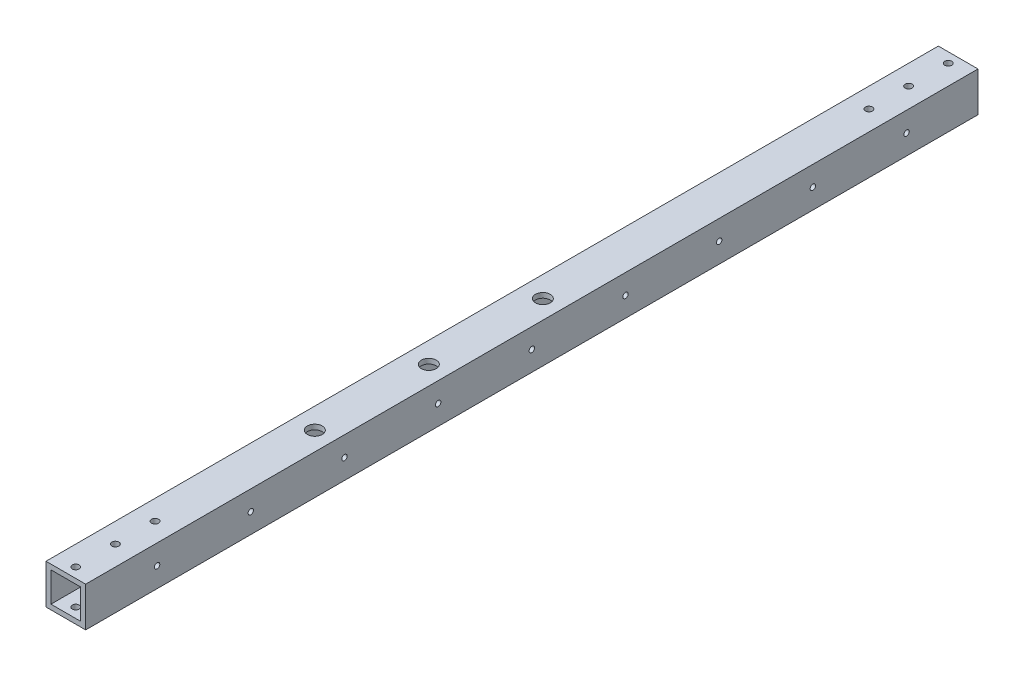
ISO-10303-21;
HEADER;
FILE_DESCRIPTION(('STEP AP214'),'2;1');
FILE_NAME('part.step','',(''),(''),'','','');
FILE_SCHEMA(('AUTOMOTIVE_DESIGN { 1 0 10303 214 1 1 1 1 }'));
ENDSEC;
DATA;
#1=APPLICATION_CONTEXT('core data for automotive mechanical design processes');
#2=APPLICATION_PROTOCOL_DEFINITION('international standard','automotive_design',2000,#1);
#3=PRODUCT_CONTEXT('',#1,'mechanical');
#4=PRODUCT('Part','Part','',(#3));
#5=PRODUCT_RELATED_PRODUCT_CATEGORY('part','',(#4));
#6=PRODUCT_DEFINITION_FORMATION('','',#4);
#7=PRODUCT_DEFINITION_CONTEXT('part definition',#1,'design');
#8=PRODUCT_DEFINITION('design','',#6,#7);
#9=PRODUCT_DEFINITION_SHAPE('','',#8);
#10=(LENGTH_UNIT() NAMED_UNIT(*) SI_UNIT(.MILLI.,.METRE.));
#11=(NAMED_UNIT(*) PLANE_ANGLE_UNIT() SI_UNIT($,.RADIAN.));
#12=(NAMED_UNIT(*) SI_UNIT($,.STERADIAN.) SOLID_ANGLE_UNIT());
#13=UNCERTAINTY_MEASURE_WITH_UNIT(LENGTH_MEASURE(1.E-05),#10,'distance_accuracy_value','');
#14=(GEOMETRIC_REPRESENTATION_CONTEXT(3) GLOBAL_UNCERTAINTY_ASSIGNED_CONTEXT((#13)) GLOBAL_UNIT_ASSIGNED_CONTEXT((#10,
#11,#12)) REPRESENTATION_CONTEXT('',''));
#15=CARTESIAN_POINT('',(0.,0.,0.));
#16=DIRECTION('',(0.,0.,1.));
#17=DIRECTION('',(1.,0.,0.));
#18=AXIS2_PLACEMENT_3D('',#15,#16,#17);
#19=CARTESIAN_POINT('',(-12.7,-12.7,571.5));
#20=DIRECTION('',(0.,1.,0.));
#21=DIRECTION('',(0.,0.,1.));
#22=AXIS2_PLACEMENT_3D('',#19,#20,#21);
#23=PLANE('',#22);
#24=CARTESIAN_POINT('',(0.700000000011636,-12.6999999999999,339.725));
#25=DIRECTION('',(0.,-1.,0.));
#26=DIRECTION('',(0.,0.,-1.));
#27=AXIS2_PLACEMENT_3D('',#24,#25,#26);
#28=CIRCLE('',#27,4.76249999999999);
#29=CARTESIAN_POINT('',(0.700000000011636,-12.6999999999999,334.9625));
#30=VERTEX_POINT('',#29);
#31=EDGE_CURVE('E420',#30,#30,#28,.T.);
#32=ORIENTED_EDGE('',*,*,#31,.F.);
#33=EDGE_LOOP('',(#32));
#34=FACE_BOUND('',#33,.T.);
#35=CARTESIAN_POINT('',(0.700000000011636,-12.6999999999999,412.75));
#36=DIRECTION('',(0.,-1.,0.));
#37=DIRECTION('',(0.,0.,-1.));
#38=AXIS2_PLACEMENT_3D('',#35,#36,#37);
#39=CIRCLE('',#38,4.76249999999999);
#40=CARTESIAN_POINT('',(0.700000000011636,-12.6999999999999,407.9875));
#41=VERTEX_POINT('',#40);
#42=EDGE_CURVE('E241',#41,#41,#39,.T.);
#43=ORIENTED_EDGE('',*,*,#42,.F.);
#44=EDGE_LOOP('',(#43));
#45=FACE_BOUND('',#44,.T.);
#46=CARTESIAN_POINT('',(0.,-12.7,6.35));
#47=DIRECTION('',(0.,1.,0.));
#48=DIRECTION('',(0.,0.,1.));
#49=AXIS2_PLACEMENT_3D('',#46,#47,#48);
#50=CIRCLE('',#49,2.24789999999999);
#51=CARTESIAN_POINT('',(0.,-12.7,8.59789999999999));
#52=VERTEX_POINT('',#51);
#53=EDGE_CURVE('E210',#52,#52,#50,.T.);
#54=ORIENTED_EDGE('',*,*,#53,.T.);
#55=EDGE_LOOP('',(#54));
#56=FACE_BOUND('',#55,.T.);
#57=CARTESIAN_POINT('',(0.,-12.7,31.75));
#58=DIRECTION('',(0.,1.,0.));
#59=DIRECTION('',(0.,0.,1.));
#60=AXIS2_PLACEMENT_3D('',#57,#58,#59);
#61=CIRCLE('',#60,2.24789999999999);
#62=CARTESIAN_POINT('',(0.,-12.7,33.9979));
#63=VERTEX_POINT('',#62);
#64=EDGE_CURVE('E205',#63,#63,#61,.T.);
#65=ORIENTED_EDGE('',*,*,#64,.T.);
#66=EDGE_LOOP('',(#65));
#67=FACE_BOUND('',#66,.T.);
#68=CARTESIAN_POINT('',(0.,-12.7,57.1499999999999));
#69=DIRECTION('',(0.,1.,0.));
#70=DIRECTION('',(0.,0.,1.));
#71=AXIS2_PLACEMENT_3D('',#68,#69,#70);
#72=CIRCLE('',#71,2.24789999999999);
#73=CARTESIAN_POINT('',(0.,-12.7,59.3978999999999));
#74=VERTEX_POINT('',#73);
#75=EDGE_CURVE('E299',#74,#74,#72,.T.);
#76=ORIENTED_EDGE('',*,*,#75,.T.);
#77=EDGE_LOOP('',(#76));
#78=FACE_BOUND('',#77,.T.);
#79=CARTESIAN_POINT('',(0.,-12.7,539.75));
#80=DIRECTION('',(0.,1.,0.));
#81=DIRECTION('',(0.,0.,1.));
#82=AXIS2_PLACEMENT_3D('',#79,#80,#81);
#83=CIRCLE('',#82,2.24789999999999);
#84=CARTESIAN_POINT('',(0.,-12.7,541.9979));
#85=VERTEX_POINT('',#84);
#86=EDGE_CURVE('E200',#85,#85,#83,.T.);
#87=ORIENTED_EDGE('',*,*,#86,.T.);
#88=EDGE_LOOP('',(#87));
#89=FACE_BOUND('',#88,.T.);
#90=CARTESIAN_POINT('',(0.,-12.7,514.35));
#91=DIRECTION('',(0.,1.,0.));
#92=DIRECTION('',(0.,0.,1.));
#93=AXIS2_PLACEMENT_3D('',#90,#91,#92);
#94=CIRCLE('',#93,2.24789999999999);
#95=CARTESIAN_POINT('',(0.,-12.7,516.5979));
#96=VERTEX_POINT('',#95);
#97=EDGE_CURVE('E318',#96,#96,#94,.T.);
#98=ORIENTED_EDGE('',*,*,#97,.T.);
#99=EDGE_LOOP('',(#98));
#100=FACE_BOUND('',#99,.T.);
#101=CARTESIAN_POINT('',(0.,-12.7,565.15));
#102=DIRECTION('',(0.,1.,0.));
#103=DIRECTION('',(0.,0.,1.));
#104=AXIS2_PLACEMENT_3D('',#101,#102,#103);
#105=CIRCLE('',#104,2.24789999999999);
#106=CARTESIAN_POINT('',(0.,-12.7,567.3979));
#107=VERTEX_POINT('',#106);
#108=EDGE_CURVE('E195',#107,#107,#105,.T.);
#109=ORIENTED_EDGE('',*,*,#108,.T.);
#110=EDGE_LOOP('',(#109));
#111=FACE_BOUND('',#110,.T.);
#112=DIRECTION('',(1.,0.,0.));
#113=VECTOR('',#112,1.);
#114=CARTESIAN_POINT('',(-12.7,-12.7,0.));
#115=LINE('',#114,#113);
#116=CARTESIAN_POINT('',(-12.7,-12.7,0.));
#117=VERTEX_POINT('',#116);
#118=CARTESIAN_POINT('',(12.7,-12.7,0.));
#119=VERTEX_POINT('',#118);
#120=EDGE_CURVE('E171',#117,#119,#115,.T.);
#121=ORIENTED_EDGE('',*,*,#120,.T.);
#122=DIRECTION('',(0.,0.,-1.));
#123=VECTOR('',#122,1.);
#124=CARTESIAN_POINT('',(12.7,-12.7,571.5));
#125=LINE('',#124,#123);
#126=CARTESIAN_POINT('',(12.7,-12.7,571.5));
#127=VERTEX_POINT('',#126);
#128=EDGE_CURVE('E177',#127,#119,#125,.T.);
#129=ORIENTED_EDGE('',*,*,#128,.F.);
#130=DIRECTION('',(1.,0.,0.));
#131=VECTOR('',#130,1.);
#132=CARTESIAN_POINT('',(-12.7,-12.7,571.5));
#133=LINE('',#132,#131);
#134=CARTESIAN_POINT('',(-12.7,-12.7,571.5));
#135=VERTEX_POINT('',#134);
#136=EDGE_CURVE('E175',#135,#127,#133,.T.);
#137=ORIENTED_EDGE('',*,*,#136,.F.);
#138=DIRECTION('',(0.,0.,-1.));
#139=VECTOR('',#138,1.);
#140=CARTESIAN_POINT('',(-12.7,-12.7,571.5));
#141=LINE('',#140,#139);
#142=EDGE_CURVE('E187',#135,#117,#141,.T.);
#143=ORIENTED_EDGE('',*,*,#142,.T.);
#144=EDGE_LOOP('',(#121,#129,#137,#143));
#145=FACE_BOUND('',#144,.T.);
#146=CARTESIAN_POINT('',(0.700000000011636,-12.6999999999999,266.700000000001));
#147=DIRECTION('',(0.,-1.,0.));
#148=DIRECTION('',(0.,0.,-1.));
#149=AXIS2_PLACEMENT_3D('',#146,#147,#148);
#150=CIRCLE('',#149,4.76249999999999);
#151=CARTESIAN_POINT('',(0.700000000011636,-12.6999999999999,261.937500000001));
#152=VERTEX_POINT('',#151);
#153=EDGE_CURVE('E412',#152,#152,#150,.T.);
#154=ORIENTED_EDGE('',*,*,#153,.F.);
#155=EDGE_LOOP('',(#154));
#156=FACE_BOUND('',#155,.T.);
#157=ADVANCED_FACE('F61',(#34,#45,#56,#67,#78,#89,#100,#111,#145,#156),#23,.F.);
#158=CARTESIAN_POINT('',(0.,0.,571.5));
#159=DIRECTION('',(0.,0.,1.));
#160=DIRECTION('',(1.,0.,0.));
#161=AXIS2_PLACEMENT_3D('',#158,#159,#160);
#162=PLANE('',#161);
#163=DIRECTION('',(0.,1.,0.));
#164=VECTOR('',#163,1.);
#165=CARTESIAN_POINT('',(12.7,-12.7,571.5));
#166=LINE('',#165,#164);
#167=CARTESIAN_POINT('',(12.7,12.7,571.5));
#168=VERTEX_POINT('',#167);
#169=EDGE_CURVE('E167',#127,#168,#166,.T.);
#170=ORIENTED_EDGE('',*,*,#169,.T.);
#171=DIRECTION('',(-1.,0.,0.));
#172=VECTOR('',#171,1.);
#173=CARTESIAN_POINT('',(-12.7,12.7,571.5));
#174=LINE('',#173,#172);
#175=CARTESIAN_POINT('',(-12.7,12.7,571.5));
#176=VERTEX_POINT('',#175);
#177=EDGE_CURVE('E170',#168,#176,#174,.T.);
#178=ORIENTED_EDGE('',*,*,#177,.T.);
#179=DIRECTION('',(0.,-1.,0.));
#180=VECTOR('',#179,1.);
#181=CARTESIAN_POINT('',(-12.7,-12.7,571.5));
#182=LINE('',#181,#180);
#183=EDGE_CURVE('E173',#176,#135,#182,.T.);
#184=ORIENTED_EDGE('',*,*,#183,.T.);
#185=ORIENTED_EDGE('',*,*,#136,.T.);
#186=EDGE_LOOP('',(#170,#178,#184,#185));
#187=FACE_BOUND('',#186,.T.);
#188=DIRECTION('',(-1.,0.,0.));
#189=VECTOR('',#188,1.);
#190=CARTESIAN_POINT('',(0.,9.525,571.5));
#191=LINE('',#190,#189);
#192=CARTESIAN_POINT('',(9.525,9.525,571.5));
#193=VERTEX_POINT('',#192);
#194=CARTESIAN_POINT('',(-9.525,9.525,571.5));
#195=VERTEX_POINT('',#194);
#196=EDGE_CURVE('E136',#193,#195,#191,.T.);
#197=ORIENTED_EDGE('',*,*,#196,.F.);
#198=DIRECTION('',(0.,1.,0.));
#199=VECTOR('',#198,1.);
#200=CARTESIAN_POINT('',(9.525,0.,571.5));
#201=LINE('',#200,#199);
#202=CARTESIAN_POINT('',(9.525,-9.525,571.5));
#203=VERTEX_POINT('',#202);
#204=EDGE_CURVE('E128',#203,#193,#201,.T.);
#205=ORIENTED_EDGE('',*,*,#204,.F.);
#206=DIRECTION('',(1.,0.,0.));
#207=VECTOR('',#206,1.);
#208=CARTESIAN_POINT('',(0.,-9.525,571.5));
#209=LINE('',#208,#207);
#210=CARTESIAN_POINT('',(-9.525,-9.525,571.5));
#211=VERTEX_POINT('',#210);
#212=EDGE_CURVE('E151',#211,#203,#209,.T.);
#213=ORIENTED_EDGE('',*,*,#212,.F.);
#214=DIRECTION('',(0.,-1.,0.));
#215=VECTOR('',#214,1.);
#216=CARTESIAN_POINT('',(-9.525,0.,571.5));
#217=LINE('',#216,#215);
#218=EDGE_CURVE('E149',#195,#211,#217,.T.);
#219=ORIENTED_EDGE('',*,*,#218,.F.);
#220=EDGE_LOOP('',(#197,#205,#213,#219));
#221=FACE_BOUND('',#220,.T.);
#222=ADVANCED_FACE('F148',(#187,#221),#162,.T.);
#223=CARTESIAN_POINT('',(0.,0.,0.));
#224=DIRECTION('',(0.,0.,1.));
#225=DIRECTION('',(1.,0.,0.));
#226=AXIS2_PLACEMENT_3D('',#223,#224,#225);
#227=PLANE('',#226);
#228=DIRECTION('',(0.,1.,0.));
#229=VECTOR('',#228,1.);
#230=CARTESIAN_POINT('',(12.7,-12.7,0.));
#231=LINE('',#230,#229);
#232=CARTESIAN_POINT('',(12.7,12.7,0.));
#233=VERTEX_POINT('',#232);
#234=EDGE_CURVE('E144',#119,#233,#231,.T.);
#235=ORIENTED_EDGE('',*,*,#234,.F.);
#236=ORIENTED_EDGE('',*,*,#120,.F.);
#237=DIRECTION('',(0.,-1.,0.));
#238=VECTOR('',#237,1.);
#239=CARTESIAN_POINT('',(-12.7,-12.7,0.));
#240=LINE('',#239,#238);
#241=CARTESIAN_POINT('',(-12.7,12.7,0.));
#242=VERTEX_POINT('',#241);
#243=EDGE_CURVE('E182',#242,#117,#240,.T.);
#244=ORIENTED_EDGE('',*,*,#243,.F.);
#245=DIRECTION('',(-1.,0.,0.));
#246=VECTOR('',#245,1.);
#247=CARTESIAN_POINT('',(-12.7,12.7,0.));
#248=LINE('',#247,#246);
#249=EDGE_CURVE('E180',#233,#242,#248,.T.);
#250=ORIENTED_EDGE('',*,*,#249,.F.);
#251=EDGE_LOOP('',(#235,#236,#244,#250));
#252=FACE_BOUND('',#251,.T.);
#253=DIRECTION('',(0.,1.,0.));
#254=VECTOR('',#253,1.);
#255=CARTESIAN_POINT('',(9.525,0.,0.));
#256=LINE('',#255,#254);
#257=CARTESIAN_POINT('',(9.525,-9.525,0.));
#258=VERTEX_POINT('',#257);
#259=CARTESIAN_POINT('',(9.525,9.525,0.));
#260=VERTEX_POINT('',#259);
#261=EDGE_CURVE('E86',#258,#260,#256,.T.);
#262=ORIENTED_EDGE('',*,*,#261,.T.);
#263=DIRECTION('',(-1.,0.,0.));
#264=VECTOR('',#263,1.);
#265=CARTESIAN_POINT('',(0.,9.525,0.));
#266=LINE('',#265,#264);
#267=CARTESIAN_POINT('',(-9.525,9.525,0.));
#268=VERTEX_POINT('',#267);
#269=EDGE_CURVE('E143',#260,#268,#266,.T.);
#270=ORIENTED_EDGE('',*,*,#269,.T.);
#271=DIRECTION('',(0.,-1.,0.));
#272=VECTOR('',#271,1.);
#273=CARTESIAN_POINT('',(-9.525,0.,0.));
#274=LINE('',#273,#272);
#275=CARTESIAN_POINT('',(-9.525,-9.525,0.));
#276=VERTEX_POINT('',#275);
#277=EDGE_CURVE('E159',#268,#276,#274,.T.);
#278=ORIENTED_EDGE('',*,*,#277,.T.);
#279=DIRECTION('',(1.,0.,0.));
#280=VECTOR('',#279,1.);
#281=CARTESIAN_POINT('',(0.,-9.525,0.));
#282=LINE('',#281,#280);
#283=EDGE_CURVE('E137',#276,#258,#282,.T.);
#284=ORIENTED_EDGE('',*,*,#283,.T.);
#285=EDGE_LOOP('',(#262,#270,#278,#284));
#286=FACE_BOUND('',#285,.T.);
#287=ADVANCED_FACE('F359',(#252,#286),#227,.F.);
#288=CARTESIAN_POINT('',(12.7,-12.7,571.5));
#289=DIRECTION('',(-1.,0.,0.));
#290=DIRECTION('',(0.,-1.,0.));
#291=AXIS2_PLACEMENT_3D('',#288,#289,#290);
#292=PLANE('',#291);
#293=CARTESIAN_POINT('',(12.7,0.,45.7499999999999));
#294=DIRECTION('',(1.,0.,0.));
#295=DIRECTION('',(0.,0.,-1.));
#296=AXIS2_PLACEMENT_3D('',#293,#294,#295);
#297=CIRCLE('',#296,1.7272);
#298=CARTESIAN_POINT('',(12.7,0.,44.0227999999999));
#299=VERTEX_POINT('',#298);
#300=EDGE_CURVE('E231',#299,#299,#297,.T.);
#301=ORIENTED_EDGE('',*,*,#300,.F.);
#302=EDGE_LOOP('',(#301));
#303=FACE_BOUND('',#302,.T.);
#304=CARTESIAN_POINT('',(12.7,0.,105.75));
#305=DIRECTION('',(1.,0.,0.));
#306=DIRECTION('',(0.,0.,-1.));
#307=AXIS2_PLACEMENT_3D('',#304,#305,#306);
#308=CIRCLE('',#307,1.7272);
#309=CARTESIAN_POINT('',(12.7,0.,104.0228));
#310=VERTEX_POINT('',#309);
#311=EDGE_CURVE('E228',#310,#310,#308,.T.);
#312=ORIENTED_EDGE('',*,*,#311,.F.);
#313=EDGE_LOOP('',(#312));
#314=FACE_BOUND('',#313,.T.);
#315=CARTESIAN_POINT('',(12.7,0.,225.75));
#316=DIRECTION('',(1.,0.,0.));
#317=DIRECTION('',(0.,0.,-1.));
#318=AXIS2_PLACEMENT_3D('',#315,#316,#317);
#319=CIRCLE('',#318,1.7272);
#320=CARTESIAN_POINT('',(12.7,0.,224.0228));
#321=VERTEX_POINT('',#320);
#322=EDGE_CURVE('E227',#321,#321,#319,.T.);
#323=ORIENTED_EDGE('',*,*,#322,.F.);
#324=EDGE_LOOP('',(#323));
#325=FACE_BOUND('',#324,.T.);
#326=CARTESIAN_POINT('',(12.7,0.,285.75));
#327=DIRECTION('',(1.,0.,0.));
#328=DIRECTION('',(0.,0.,-1.));
#329=AXIS2_PLACEMENT_3D('',#326,#327,#328);
#330=CIRCLE('',#329,1.7272);
#331=CARTESIAN_POINT('',(12.7,0.,284.0228));
#332=VERTEX_POINT('',#331);
#333=EDGE_CURVE('E259',#332,#332,#330,.T.);
#334=ORIENTED_EDGE('',*,*,#333,.F.);
#335=EDGE_LOOP('',(#334));
#336=FACE_BOUND('',#335,.T.);
#337=CARTESIAN_POINT('',(12.7,0.,345.75));
#338=DIRECTION('',(1.,0.,0.));
#339=DIRECTION('',(0.,0.,-1.));
#340=AXIS2_PLACEMENT_3D('',#337,#338,#339);
#341=CIRCLE('',#340,1.7272);
#342=CARTESIAN_POINT('',(12.7,0.,344.0228));
#343=VERTEX_POINT('',#342);
#344=EDGE_CURVE('E223',#343,#343,#341,.T.);
#345=ORIENTED_EDGE('',*,*,#344,.F.);
#346=EDGE_LOOP('',(#345));
#347=FACE_BOUND('',#346,.T.);
#348=CARTESIAN_POINT('',(12.7,0.,405.75));
#349=DIRECTION('',(1.,0.,0.));
#350=DIRECTION('',(0.,0.,-1.));
#351=AXIS2_PLACEMENT_3D('',#348,#349,#350);
#352=CIRCLE('',#351,1.7272);
#353=CARTESIAN_POINT('',(12.7,0.,404.0228));
#354=VERTEX_POINT('',#353);
#355=EDGE_CURVE('E219',#354,#354,#352,.T.);
#356=ORIENTED_EDGE('',*,*,#355,.F.);
#357=EDGE_LOOP('',(#356));
#358=FACE_BOUND('',#357,.T.);
#359=CARTESIAN_POINT('',(12.7,0.,465.75));
#360=DIRECTION('',(1.,0.,0.));
#361=DIRECTION('',(0.,0.,-1.));
#362=AXIS2_PLACEMENT_3D('',#359,#360,#361);
#363=CIRCLE('',#362,1.7272);
#364=CARTESIAN_POINT('',(12.7,0.,464.0228));
#365=VERTEX_POINT('',#364);
#366=EDGE_CURVE('E215',#365,#365,#363,.T.);
#367=ORIENTED_EDGE('',*,*,#366,.F.);
#368=EDGE_LOOP('',(#367));
#369=FACE_BOUND('',#368,.T.);
#370=CARTESIAN_POINT('',(12.7,0.,525.75));
#371=DIRECTION('',(1.,0.,0.));
#372=DIRECTION('',(0.,0.,-1.));
#373=AXIS2_PLACEMENT_3D('',#370,#371,#372);
#374=CIRCLE('',#373,1.7272);
#375=CARTESIAN_POINT('',(12.7,0.,524.0228));
#376=VERTEX_POINT('',#375);
#377=EDGE_CURVE('E214',#376,#376,#374,.T.);
#378=ORIENTED_EDGE('',*,*,#377,.F.);
#379=EDGE_LOOP('',(#378));
#380=FACE_BOUND('',#379,.T.);
#381=CARTESIAN_POINT('',(12.7,0.,165.75));
#382=DIRECTION('',(1.,0.,0.));
#383=DIRECTION('',(0.,0.,-1.));
#384=AXIS2_PLACEMENT_3D('',#381,#382,#383);
#385=CIRCLE('',#384,1.7272);
#386=CARTESIAN_POINT('',(12.7,0.,164.0228));
#387=VERTEX_POINT('',#386);
#388=EDGE_CURVE('E276',#387,#387,#385,.T.);
#389=ORIENTED_EDGE('',*,*,#388,.F.);
#390=EDGE_LOOP('',(#389));
#391=FACE_BOUND('',#390,.T.);
#392=ORIENTED_EDGE('',*,*,#234,.T.);
#393=DIRECTION('',(0.,0.,-1.));
#394=VECTOR('',#393,1.);
#395=CARTESIAN_POINT('',(12.7,12.7,571.5));
#396=LINE('',#395,#394);
#397=EDGE_CURVE('E12',#168,#233,#396,.T.);
#398=ORIENTED_EDGE('',*,*,#397,.F.);
#399=ORIENTED_EDGE('',*,*,#169,.F.);
#400=ORIENTED_EDGE('',*,*,#128,.T.);
#401=EDGE_LOOP('',(#392,#398,#399,#400));
#402=FACE_BOUND('',#401,.T.);
#403=ADVANCED_FACE('F63',(#303,#314,#325,#336,#347,#358,#369,#380,#391,#402),#292,.F.);
#404=CARTESIAN_POINT('',(-12.7,12.7,571.5));
#405=DIRECTION('',(0.,-1.,0.));
#406=DIRECTION('',(0.,0.,-1.));
#407=AXIS2_PLACEMENT_3D('',#404,#405,#406);
#408=PLANE('',#407);
#409=CARTESIAN_POINT('',(0.700000000011636,12.7,266.700000000001));
#410=DIRECTION('',(0.,-1.,0.));
#411=DIRECTION('',(0.,0.,-1.));
#412=AXIS2_PLACEMENT_3D('',#409,#410,#411);
#413=CIRCLE('',#412,4.76249999999999);
#414=CARTESIAN_POINT('',(0.700000000011636,12.7,261.937500000001));
#415=VERTEX_POINT('',#414);
#416=EDGE_CURVE('E378',#415,#415,#413,.T.);
#417=ORIENTED_EDGE('',*,*,#416,.T.);
#418=EDGE_LOOP('',(#417));
#419=FACE_BOUND('',#418,.T.);
#420=CARTESIAN_POINT('',(0.700000000011636,12.7,339.725));
#421=DIRECTION('',(0.,-1.,0.));
#422=DIRECTION('',(0.,0.,-1.));
#423=AXIS2_PLACEMENT_3D('',#420,#421,#422);
#424=CIRCLE('',#423,4.76249999999999);
#425=CARTESIAN_POINT('',(0.700000000011636,12.7,334.9625));
#426=VERTEX_POINT('',#425);
#427=EDGE_CURVE('E381',#426,#426,#424,.T.);
#428=ORIENTED_EDGE('',*,*,#427,.T.);
#429=EDGE_LOOP('',(#428));
#430=FACE_BOUND('',#429,.T.);
#431=CARTESIAN_POINT('',(0.700000000011636,12.7,412.75));
#432=DIRECTION('',(0.,-1.,0.));
#433=DIRECTION('',(0.,0.,-1.));
#434=AXIS2_PLACEMENT_3D('',#431,#432,#433);
#435=CIRCLE('',#434,4.76249999999999);
#436=CARTESIAN_POINT('',(0.700000000011636,12.7,407.9875));
#437=VERTEX_POINT('',#436);
#438=EDGE_CURVE('E235',#437,#437,#435,.T.);
#439=ORIENTED_EDGE('',*,*,#438,.T.);
#440=EDGE_LOOP('',(#439));
#441=FACE_BOUND('',#440,.T.);
#442=CARTESIAN_POINT('',(0.,12.7,6.35));
#443=DIRECTION('',(0.,1.,0.));
#444=DIRECTION('',(0.,0.,1.));
#445=AXIS2_PLACEMENT_3D('',#442,#443,#444);
#446=CIRCLE('',#445,2.2479);
#447=CARTESIAN_POINT('',(0.,12.7,8.5979));
#448=VERTEX_POINT('',#447);
#449=EDGE_CURVE('E282',#448,#448,#446,.T.);
#450=ORIENTED_EDGE('',*,*,#449,.F.);
#451=EDGE_LOOP('',(#450));
#452=FACE_BOUND('',#451,.T.);
#453=CARTESIAN_POINT('',(0.,12.7,31.75));
#454=DIRECTION('',(0.,1.,0.));
#455=DIRECTION('',(0.,0.,1.));
#456=AXIS2_PLACEMENT_3D('',#453,#454,#455);
#457=CIRCLE('',#456,2.2479);
#458=CARTESIAN_POINT('',(0.,12.7,33.9979));
#459=VERTEX_POINT('',#458);
#460=EDGE_CURVE('E289',#459,#459,#457,.T.);
#461=ORIENTED_EDGE('',*,*,#460,.F.);
#462=EDGE_LOOP('',(#461));
#463=FACE_BOUND('',#462,.T.);
#464=CARTESIAN_POINT('',(0.,12.7,57.1499999999999));
#465=DIRECTION('',(0.,1.,0.));
#466=DIRECTION('',(0.,0.,1.));
#467=AXIS2_PLACEMENT_3D('',#464,#465,#466);
#468=CIRCLE('',#467,2.2479);
#469=CARTESIAN_POINT('',(0.,12.7,59.3978999999999));
#470=VERTEX_POINT('',#469);
#471=EDGE_CURVE('E296',#470,#470,#468,.T.);
#472=ORIENTED_EDGE('',*,*,#471,.F.);
#473=EDGE_LOOP('',(#472));
#474=FACE_BOUND('',#473,.T.);
#475=CARTESIAN_POINT('',(0.,12.7,539.75));
#476=DIRECTION('',(0.,1.,0.));
#477=DIRECTION('',(0.,0.,1.));
#478=AXIS2_PLACEMENT_3D('',#475,#476,#477);
#479=CIRCLE('',#478,2.2479);
#480=CARTESIAN_POINT('',(0.,12.7,541.9979));
#481=VERTEX_POINT('',#480);
#482=EDGE_CURVE('E308',#481,#481,#479,.T.);
#483=ORIENTED_EDGE('',*,*,#482,.F.);
#484=EDGE_LOOP('',(#483));
#485=FACE_BOUND('',#484,.T.);
#486=CARTESIAN_POINT('',(0.,12.7,514.35));
#487=DIRECTION('',(0.,1.,0.));
#488=DIRECTION('',(0.,0.,1.));
#489=AXIS2_PLACEMENT_3D('',#486,#487,#488);
#490=CIRCLE('',#489,2.2479);
#491=CARTESIAN_POINT('',(0.,12.7,516.5979));
#492=VERTEX_POINT('',#491);
#493=EDGE_CURVE('E315',#492,#492,#490,.T.);
#494=ORIENTED_EDGE('',*,*,#493,.F.);
#495=EDGE_LOOP('',(#494));
#496=FACE_BOUND('',#495,.T.);
#497=CARTESIAN_POINT('',(0.,12.7,565.15));
#498=DIRECTION('',(0.,1.,0.));
#499=DIRECTION('',(0.,0.,1.));
#500=AXIS2_PLACEMENT_3D('',#497,#498,#499);
#501=CIRCLE('',#500,2.2479);
#502=CARTESIAN_POINT('',(0.,12.7,567.3979));
#503=VERTEX_POINT('',#502);
#504=EDGE_CURVE('E327',#503,#503,#501,.T.);
#505=ORIENTED_EDGE('',*,*,#504,.F.);
#506=EDGE_LOOP('',(#505));
#507=FACE_BOUND('',#506,.T.);
#508=ORIENTED_EDGE('',*,*,#249,.T.);
#509=DIRECTION('',(0.,0.,-1.));
#510=VECTOR('',#509,1.);
#511=CARTESIAN_POINT('',(-12.7,12.7,571.5));
#512=LINE('',#511,#510);
#513=EDGE_CURVE('E70',#176,#242,#512,.T.);
#514=ORIENTED_EDGE('',*,*,#513,.F.);
#515=ORIENTED_EDGE('',*,*,#177,.F.);
#516=ORIENTED_EDGE('',*,*,#397,.T.);
#517=EDGE_LOOP('',(#508,#514,#515,#516));
#518=FACE_BOUND('',#517,.T.);
#519=ADVANCED_FACE('F367',(#419,#430,#441,#452,#463,#474,#485,#496,#507,#518),#408,.F.);
#520=CARTESIAN_POINT('',(-12.7,-12.7,571.5));
#521=DIRECTION('',(1.,0.,0.));
#522=DIRECTION('',(0.,0.,-1.));
#523=AXIS2_PLACEMENT_3D('',#520,#521,#522);
#524=PLANE('',#523);
#525=ORIENTED_EDGE('',*,*,#243,.T.);
#526=ORIENTED_EDGE('',*,*,#142,.F.);
#527=ORIENTED_EDGE('',*,*,#183,.F.);
#528=ORIENTED_EDGE('',*,*,#513,.T.);
#529=EDGE_LOOP('',(#525,#526,#527,#528));
#530=FACE_BOUND('',#529,.T.);
#531=ADVANCED_FACE('F348',(#530),#524,.F.);
#532=CARTESIAN_POINT('',(9.525,0.,571.5));
#533=DIRECTION('',(-1.,0.,0.));
#534=DIRECTION('',(0.,-1.,0.));
#535=AXIS2_PLACEMENT_3D('',#532,#533,#534);
#536=PLANE('',#535);
#537=CARTESIAN_POINT('',(9.525,0.,45.7499999999999));
#538=DIRECTION('',(-1.,0.,0.));
#539=DIRECTION('',(0.,-1.,0.));
#540=AXIS2_PLACEMENT_3D('',#537,#538,#539);
#541=CIRCLE('',#540,1.7272);
#542=CARTESIAN_POINT('',(9.525,-1.72719999999997,45.7499999999999));
#543=VERTEX_POINT('',#542);
#544=EDGE_CURVE('E229',#543,#543,#541,.T.);
#545=ORIENTED_EDGE('',*,*,#544,.F.);
#546=EDGE_LOOP('',(#545));
#547=FACE_BOUND('',#546,.T.);
#548=CARTESIAN_POINT('',(9.525,0.,105.75));
#549=DIRECTION('',(-1.,0.,0.));
#550=DIRECTION('',(0.,-1.,0.));
#551=AXIS2_PLACEMENT_3D('',#548,#549,#550);
#552=CIRCLE('',#551,1.7272);
#553=CARTESIAN_POINT('',(9.525,-1.72719999999997,105.75));
#554=VERTEX_POINT('',#553);
#555=EDGE_CURVE('E224',#554,#554,#552,.T.);
#556=ORIENTED_EDGE('',*,*,#555,.F.);
#557=EDGE_LOOP('',(#556));
#558=FACE_BOUND('',#557,.T.);
#559=CARTESIAN_POINT('',(9.525,0.,225.75));
#560=DIRECTION('',(-1.,0.,0.));
#561=DIRECTION('',(0.,-1.,0.));
#562=AXIS2_PLACEMENT_3D('',#559,#560,#561);
#563=CIRCLE('',#562,1.7272);
#564=CARTESIAN_POINT('',(9.525,-1.72719999999997,225.75));
#565=VERTEX_POINT('',#564);
#566=EDGE_CURVE('E256',#565,#565,#563,.T.);
#567=ORIENTED_EDGE('',*,*,#566,.F.);
#568=EDGE_LOOP('',(#567));
#569=FACE_BOUND('',#568,.T.);
#570=CARTESIAN_POINT('',(9.525,0.,285.75));
#571=DIRECTION('',(-1.,0.,0.));
#572=DIRECTION('',(0.,-1.,0.));
#573=AXIS2_PLACEMENT_3D('',#570,#571,#572);
#574=CIRCLE('',#573,1.7272);
#575=CARTESIAN_POINT('',(9.525,-1.72719999999997,285.75));
#576=VERTEX_POINT('',#575);
#577=EDGE_CURVE('E262',#576,#576,#574,.T.);
#578=ORIENTED_EDGE('',*,*,#577,.F.);
#579=EDGE_LOOP('',(#578));
#580=FACE_BOUND('',#579,.T.);
#581=CARTESIAN_POINT('',(9.525,0.,345.75));
#582=DIRECTION('',(-1.,0.,0.));
#583=DIRECTION('',(0.,-1.,0.));
#584=AXIS2_PLACEMENT_3D('',#581,#582,#583);
#585=CIRCLE('',#584,1.7272);
#586=CARTESIAN_POINT('',(9.525,-1.72719999999997,345.75));
#587=VERTEX_POINT('',#586);
#588=EDGE_CURVE('E220',#587,#587,#585,.T.);
#589=ORIENTED_EDGE('',*,*,#588,.F.);
#590=EDGE_LOOP('',(#589));
#591=FACE_BOUND('',#590,.T.);
#592=CARTESIAN_POINT('',(9.525,0.,405.75));
#593=DIRECTION('',(-1.,0.,0.));
#594=DIRECTION('',(0.,-1.,0.));
#595=AXIS2_PLACEMENT_3D('',#592,#593,#594);
#596=CIRCLE('',#595,1.7272);
#597=CARTESIAN_POINT('',(9.525,-1.72719999999998,405.75));
#598=VERTEX_POINT('',#597);
#599=EDGE_CURVE('E216',#598,#598,#596,.T.);
#600=ORIENTED_EDGE('',*,*,#599,.F.);
#601=EDGE_LOOP('',(#600));
#602=FACE_BOUND('',#601,.T.);
#603=CARTESIAN_POINT('',(9.525,0.,465.75));
#604=DIRECTION('',(-1.,0.,0.));
#605=DIRECTION('',(0.,-1.,0.));
#606=AXIS2_PLACEMENT_3D('',#603,#604,#605);
#607=CIRCLE('',#606,1.7272);
#608=CARTESIAN_POINT('',(9.525,-1.72719999999998,465.75));
#609=VERTEX_POINT('',#608);
#610=EDGE_CURVE('E211',#609,#609,#607,.T.);
#611=ORIENTED_EDGE('',*,*,#610,.F.);
#612=EDGE_LOOP('',(#611));
#613=FACE_BOUND('',#612,.T.);
#614=CARTESIAN_POINT('',(9.525,0.,525.75));
#615=DIRECTION('',(-1.,0.,0.));
#616=DIRECTION('',(0.,-1.,0.));
#617=AXIS2_PLACEMENT_3D('',#614,#615,#616);
#618=CIRCLE('',#617,1.7272);
#619=CARTESIAN_POINT('',(9.525,-1.72719999999998,525.75));
#620=VERTEX_POINT('',#619);
#621=EDGE_CURVE('E273',#620,#620,#618,.T.);
#622=ORIENTED_EDGE('',*,*,#621,.F.);
#623=EDGE_LOOP('',(#622));
#624=FACE_BOUND('',#623,.T.);
#625=CARTESIAN_POINT('',(9.525,0.,165.75));
#626=DIRECTION('',(-1.,0.,0.));
#627=DIRECTION('',(0.,-1.,0.));
#628=AXIS2_PLACEMENT_3D('',#625,#626,#627);
#629=CIRCLE('',#628,1.7272);
#630=CARTESIAN_POINT('',(9.525,-1.72719999999997,165.75));
#631=VERTEX_POINT('',#630);
#632=EDGE_CURVE('E279',#631,#631,#629,.T.);
#633=ORIENTED_EDGE('',*,*,#632,.F.);
#634=EDGE_LOOP('',(#633));
#635=FACE_BOUND('',#634,.T.);
#636=ORIENTED_EDGE('',*,*,#261,.F.);
#637=DIRECTION('',(0.,0.,-1.));
#638=VECTOR('',#637,1.);
#639=CARTESIAN_POINT('',(9.525,-9.525,571.5));
#640=LINE('',#639,#638);
#641=EDGE_CURVE('E132',#203,#258,#640,.T.);
#642=ORIENTED_EDGE('',*,*,#641,.F.);
#643=ORIENTED_EDGE('',*,*,#204,.T.);
#644=DIRECTION('',(0.,0.,-1.));
#645=VECTOR('',#644,1.);
#646=CARTESIAN_POINT('',(9.525,9.525,571.5));
#647=LINE('',#646,#645);
#648=EDGE_CURVE('E131',#193,#260,#647,.T.);
#649=ORIENTED_EDGE('',*,*,#648,.T.);
#650=EDGE_LOOP('',(#636,#642,#643,#649));
#651=FACE_BOUND('',#650,.T.);
#652=ADVANCED_FACE('F130',(#547,#558,#569,#580,#591,#602,#613,#624,#635,#651),#536,.T.);
#653=CARTESIAN_POINT('',(0.,9.525,571.5));
#654=DIRECTION('',(0.,-1.,0.));
#655=DIRECTION('',(0.,0.,-1.));
#656=AXIS2_PLACEMENT_3D('',#653,#654,#655);
#657=PLANE('',#656);
#658=CARTESIAN_POINT('',(0.700000000011636,9.525,266.700000000001));
#659=DIRECTION('',(0.,-1.,0.));
#660=DIRECTION('',(0.,0.,-1.));
#661=AXIS2_PLACEMENT_3D('',#658,#659,#660);
#662=CIRCLE('',#661,4.76249999999999);
#663=CARTESIAN_POINT('',(0.700000000011636,9.525,261.937500000001));
#664=VERTEX_POINT('',#663);
#665=EDGE_CURVE('E417',#664,#664,#662,.T.);
#666=ORIENTED_EDGE('',*,*,#665,.F.);
#667=EDGE_LOOP('',(#666));
#668=FACE_BOUND('',#667,.T.);
#669=CARTESIAN_POINT('',(0.700000000011636,9.525,339.725));
#670=DIRECTION('',(0.,-1.,0.));
#671=DIRECTION('',(0.,0.,-1.));
#672=AXIS2_PLACEMENT_3D('',#669,#670,#671);
#673=CIRCLE('',#672,4.76249999999999);
#674=CARTESIAN_POINT('',(0.700000000011636,9.525,334.9625));
#675=VERTEX_POINT('',#674);
#676=EDGE_CURVE('E424',#675,#675,#673,.T.);
#677=ORIENTED_EDGE('',*,*,#676,.F.);
#678=EDGE_LOOP('',(#677));
#679=FACE_BOUND('',#678,.T.);
#680=CARTESIAN_POINT('',(0.700000000011636,9.525,412.75));
#681=DIRECTION('',(0.,-1.,0.));
#682=DIRECTION('',(0.,0.,-1.));
#683=AXIS2_PLACEMENT_3D('',#680,#681,#682);
#684=CIRCLE('',#683,4.76249999999999);
#685=CARTESIAN_POINT('',(0.700000000011636,9.525,407.9875));
#686=VERTEX_POINT('',#685);
#687=EDGE_CURVE('E232',#686,#686,#684,.T.);
#688=ORIENTED_EDGE('',*,*,#687,.F.);
#689=EDGE_LOOP('',(#688));
#690=FACE_BOUND('',#689,.T.);
#691=CARTESIAN_POINT('',(0.,9.525,6.35));
#692=DIRECTION('',(0.,-1.,0.));
#693=DIRECTION('',(0.,0.,-1.));
#694=AXIS2_PLACEMENT_3D('',#691,#692,#693);
#695=CIRCLE('',#694,2.2479);
#696=CARTESIAN_POINT('',(0.,9.525,4.1021));
#697=VERTEX_POINT('',#696);
#698=EDGE_CURVE('E206',#697,#697,#695,.T.);
#699=ORIENTED_EDGE('',*,*,#698,.F.);
#700=EDGE_LOOP('',(#699));
#701=FACE_BOUND('',#700,.T.);
#702=CARTESIAN_POINT('',(0.,9.525,31.75));
#703=DIRECTION('',(0.,-1.,0.));
#704=DIRECTION('',(0.,0.,-1.));
#705=AXIS2_PLACEMENT_3D('',#702,#703,#704);
#706=CIRCLE('',#705,2.2479);
#707=CARTESIAN_POINT('',(0.,9.525,29.5021));
#708=VERTEX_POINT('',#707);
#709=EDGE_CURVE('E201',#708,#708,#706,.T.);
#710=ORIENTED_EDGE('',*,*,#709,.F.);
#711=EDGE_LOOP('',(#710));
#712=FACE_BOUND('',#711,.T.);
#713=CARTESIAN_POINT('',(0.,9.525,57.1499999999999));
#714=DIRECTION('',(0.,-1.,0.));
#715=DIRECTION('',(0.,0.,-1.));
#716=AXIS2_PLACEMENT_3D('',#713,#714,#715);
#717=CIRCLE('',#716,2.2479);
#718=CARTESIAN_POINT('',(0.,9.525,54.9020999999999));
#719=VERTEX_POINT('',#718);
#720=EDGE_CURVE('E302',#719,#719,#717,.T.);
#721=ORIENTED_EDGE('',*,*,#720,.F.);
#722=EDGE_LOOP('',(#721));
#723=FACE_BOUND('',#722,.T.);
#724=CARTESIAN_POINT('',(0.,9.525,539.75));
#725=DIRECTION('',(0.,-1.,0.));
#726=DIRECTION('',(0.,0.,-1.));
#727=AXIS2_PLACEMENT_3D('',#724,#725,#726);
#728=CIRCLE('',#727,2.2479);
#729=CARTESIAN_POINT('',(0.,9.525,537.5021));
#730=VERTEX_POINT('',#729);
#731=EDGE_CURVE('E199',#730,#730,#728,.T.);
#732=ORIENTED_EDGE('',*,*,#731,.F.);
#733=EDGE_LOOP('',(#732));
#734=FACE_BOUND('',#733,.T.);
#735=CARTESIAN_POINT('',(0.,9.525,514.35));
#736=DIRECTION('',(0.,-1.,0.));
#737=DIRECTION('',(0.,0.,-1.));
#738=AXIS2_PLACEMENT_3D('',#735,#736,#737);
#739=CIRCLE('',#738,2.2479);
#740=CARTESIAN_POINT('',(0.,9.525,512.1021));
#741=VERTEX_POINT('',#740);
#742=EDGE_CURVE('E324',#741,#741,#739,.T.);
#743=ORIENTED_EDGE('',*,*,#742,.F.);
#744=EDGE_LOOP('',(#743));
#745=FACE_BOUND('',#744,.T.);
#746=CARTESIAN_POINT('',(0.,9.525,565.15));
#747=DIRECTION('',(0.,-1.,0.));
#748=DIRECTION('',(0.,0.,-1.));
#749=AXIS2_PLACEMENT_3D('',#746,#747,#748);
#750=CIRCLE('',#749,2.2479);
#751=CARTESIAN_POINT('',(0.,9.525,562.9021));
#752=VERTEX_POINT('',#751);
#753=EDGE_CURVE('E157',#752,#752,#750,.T.);
#754=ORIENTED_EDGE('',*,*,#753,.F.);
#755=EDGE_LOOP('',(#754));
#756=FACE_BOUND('',#755,.T.);
#757=ORIENTED_EDGE('',*,*,#269,.F.);
#758=ORIENTED_EDGE('',*,*,#648,.F.);
#759=ORIENTED_EDGE('',*,*,#196,.T.);
#760=DIRECTION('',(0.,0.,-1.));
#761=VECTOR('',#760,1.);
#762=CARTESIAN_POINT('',(-9.525,9.525,571.5));
#763=LINE('',#762,#761);
#764=EDGE_CURVE('E145',#195,#268,#763,.T.);
#765=ORIENTED_EDGE('',*,*,#764,.T.);
#766=EDGE_LOOP('',(#757,#758,#759,#765));
#767=FACE_BOUND('',#766,.T.);
#768=ADVANCED_FACE('F140',(#668,#679,#690,#701,#712,#723,#734,#745,#756,#767),#657,.T.);
#769=CARTESIAN_POINT('',(-9.525,0.,571.5));
#770=DIRECTION('',(1.,0.,0.));
#771=DIRECTION('',(0.,0.,-1.));
#772=AXIS2_PLACEMENT_3D('',#769,#770,#771);
#773=PLANE('',#772);
#774=ORIENTED_EDGE('',*,*,#277,.F.);
#775=ORIENTED_EDGE('',*,*,#764,.F.);
#776=ORIENTED_EDGE('',*,*,#218,.T.);
#777=DIRECTION('',(0.,0.,-1.));
#778=VECTOR('',#777,1.);
#779=CARTESIAN_POINT('',(-9.525,-9.525,571.5));
#780=LINE('',#779,#778);
#781=EDGE_CURVE('E78',#211,#276,#780,.T.);
#782=ORIENTED_EDGE('',*,*,#781,.T.);
#783=EDGE_LOOP('',(#774,#775,#776,#782));
#784=FACE_BOUND('',#783,.T.);
#785=ADVANCED_FACE('F338',(#784),#773,.T.);
#786=CARTESIAN_POINT('',(0.,-9.525,571.5));
#787=DIRECTION('',(0.,1.,0.));
#788=DIRECTION('',(0.,0.,1.));
#789=AXIS2_PLACEMENT_3D('',#786,#787,#788);
#790=PLANE('',#789);
#791=CARTESIAN_POINT('',(0.700000000011636,-9.525,266.700000000001));
#792=DIRECTION('',(0.,1.,0.));
#793=DIRECTION('',(0.,0.,1.));
#794=AXIS2_PLACEMENT_3D('',#791,#792,#793);
#795=CIRCLE('',#794,4.76249999999999);
#796=CARTESIAN_POINT('',(0.700000000011636,-9.525,271.4625));
#797=VERTEX_POINT('',#796);
#798=EDGE_CURVE('E65',#797,#797,#795,.T.);
#799=ORIENTED_EDGE('',*,*,#798,.F.);
#800=EDGE_LOOP('',(#799));
#801=FACE_BOUND('',#800,.T.);
#802=CARTESIAN_POINT('',(0.700000000011636,-9.525,339.725));
#803=DIRECTION('',(0.,1.,0.));
#804=DIRECTION('',(0.,0.,1.));
#805=AXIS2_PLACEMENT_3D('',#802,#803,#804);
#806=CIRCLE('',#805,4.76249999999999);
#807=CARTESIAN_POINT('',(0.700000000011636,-9.525,344.4875));
#808=VERTEX_POINT('',#807);
#809=EDGE_CURVE('E246',#808,#808,#806,.T.);
#810=ORIENTED_EDGE('',*,*,#809,.F.);
#811=EDGE_LOOP('',(#810));
#812=FACE_BOUND('',#811,.T.);
#813=CARTESIAN_POINT('',(0.700000000011636,-9.525,412.75));
#814=DIRECTION('',(0.,1.,0.));
#815=DIRECTION('',(0.,0.,1.));
#816=AXIS2_PLACEMENT_3D('',#813,#814,#815);
#817=CIRCLE('',#816,4.76249999999999);
#818=CARTESIAN_POINT('',(0.700000000011636,-9.525,417.5125));
#819=VERTEX_POINT('',#818);
#820=EDGE_CURVE('E234',#819,#819,#817,.T.);
#821=ORIENTED_EDGE('',*,*,#820,.F.);
#822=EDGE_LOOP('',(#821));
#823=FACE_BOUND('',#822,.T.);
#824=CARTESIAN_POINT('',(0.,-9.525,6.35));
#825=DIRECTION('',(0.,1.,0.));
#826=DIRECTION('',(0.,0.,1.));
#827=AXIS2_PLACEMENT_3D('',#824,#825,#826);
#828=CIRCLE('',#827,2.2479);
#829=CARTESIAN_POINT('',(0.,-9.525,8.5979));
#830=VERTEX_POINT('',#829);
#831=EDGE_CURVE('E209',#830,#830,#828,.T.);
#832=ORIENTED_EDGE('',*,*,#831,.F.);
#833=EDGE_LOOP('',(#832));
#834=FACE_BOUND('',#833,.T.);
#835=CARTESIAN_POINT('',(0.,-9.525,31.75));
#836=DIRECTION('',(0.,1.,0.));
#837=DIRECTION('',(0.,0.,1.));
#838=AXIS2_PLACEMENT_3D('',#835,#836,#837);
#839=CIRCLE('',#838,2.2479);
#840=CARTESIAN_POINT('',(0.,-9.525,33.9979));
#841=VERTEX_POINT('',#840);
#842=EDGE_CURVE('E204',#841,#841,#839,.T.);
#843=ORIENTED_EDGE('',*,*,#842,.F.);
#844=EDGE_LOOP('',(#843));
#845=FACE_BOUND('',#844,.T.);
#846=CARTESIAN_POINT('',(0.,-9.525,57.1499999999999));
#847=DIRECTION('',(0.,1.,0.));
#848=DIRECTION('',(0.,0.,1.));
#849=AXIS2_PLACEMENT_3D('',#846,#847,#848);
#850=CIRCLE('',#849,2.2479);
#851=CARTESIAN_POINT('',(0.,-9.525,59.3978999999999));
#852=VERTEX_POINT('',#851);
#853=EDGE_CURVE('E305',#852,#852,#850,.T.);
#854=ORIENTED_EDGE('',*,*,#853,.F.);
#855=EDGE_LOOP('',(#854));
#856=FACE_BOUND('',#855,.T.);
#857=CARTESIAN_POINT('',(0.,-9.525,539.75));
#858=DIRECTION('',(0.,1.,0.));
#859=DIRECTION('',(0.,0.,1.));
#860=AXIS2_PLACEMENT_3D('',#857,#858,#859);
#861=CIRCLE('',#860,2.2479);
#862=CARTESIAN_POINT('',(0.,-9.525,541.9979));
#863=VERTEX_POINT('',#862);
#864=EDGE_CURVE('E196',#863,#863,#861,.T.);
#865=ORIENTED_EDGE('',*,*,#864,.F.);
#866=EDGE_LOOP('',(#865));
#867=FACE_BOUND('',#866,.T.);
#868=CARTESIAN_POINT('',(0.,-9.525,514.35));
#869=DIRECTION('',(0.,1.,0.));
#870=DIRECTION('',(0.,0.,1.));
#871=AXIS2_PLACEMENT_3D('',#868,#869,#870);
#872=CIRCLE('',#871,2.2479);
#873=CARTESIAN_POINT('',(0.,-9.525,516.5979));
#874=VERTEX_POINT('',#873);
#875=EDGE_CURVE('E321',#874,#874,#872,.T.);
#876=ORIENTED_EDGE('',*,*,#875,.F.);
#877=EDGE_LOOP('',(#876));
#878=FACE_BOUND('',#877,.T.);
#879=CARTESIAN_POINT('',(0.,-9.525,565.15));
#880=DIRECTION('',(0.,1.,0.));
#881=DIRECTION('',(0.,0.,1.));
#882=AXIS2_PLACEMENT_3D('',#879,#880,#881);
#883=CIRCLE('',#882,2.2479);
#884=CARTESIAN_POINT('',(0.,-9.525,567.3979));
#885=VERTEX_POINT('',#884);
#886=EDGE_CURVE('E192',#885,#885,#883,.T.);
#887=ORIENTED_EDGE('',*,*,#886,.F.);
#888=EDGE_LOOP('',(#887));
#889=FACE_BOUND('',#888,.T.);
#890=ORIENTED_EDGE('',*,*,#283,.F.);
#891=ORIENTED_EDGE('',*,*,#781,.F.);
#892=ORIENTED_EDGE('',*,*,#212,.T.);
#893=ORIENTED_EDGE('',*,*,#641,.T.);
#894=EDGE_LOOP('',(#890,#891,#892,#893));
#895=FACE_BOUND('',#894,.T.);
#896=ADVANCED_FACE('F345',(#801,#812,#823,#834,#845,#856,#867,#878,#889,#895),#790,.T.);
#897=CARTESIAN_POINT('',(0.,12.7,565.15));
#898=DIRECTION('',(0.,1.,0.));
#899=DIRECTION('',(0.,0.,1.));
#900=AXIS2_PLACEMENT_3D('',#897,#898,#899);
#901=CYLINDRICAL_SURFACE('',#900,2.2479);
#902=ORIENTED_EDGE('',*,*,#886,.T.);
#903=EDGE_LOOP('',(#902));
#904=FACE_BOUND('',#903,.T.);
#905=ORIENTED_EDGE('',*,*,#108,.F.);
#906=EDGE_LOOP('',(#905));
#907=FACE_BOUND('',#906,.T.);
#908=ADVANCED_FACE('F434',(#904,#907),#901,.F.);
#909=ORIENTED_EDGE('',*,*,#753,.T.);
#910=EDGE_LOOP('',(#909));
#911=FACE_BOUND('',#910,.T.);
#912=ORIENTED_EDGE('',*,*,#504,.T.);
#913=EDGE_LOOP('',(#912));
#914=FACE_BOUND('',#913,.T.);
#915=ADVANCED_FACE('F334',(#911,#914),#901,.F.);
#916=CARTESIAN_POINT('',(0.,12.7,514.35));
#917=DIRECTION('',(0.,1.,0.));
#918=DIRECTION('',(0.,0.,1.));
#919=AXIS2_PLACEMENT_3D('',#916,#917,#918);
#920=CYLINDRICAL_SURFACE('',#919,2.2479);
#921=ORIENTED_EDGE('',*,*,#742,.T.);
#922=EDGE_LOOP('',(#921));
#923=FACE_BOUND('',#922,.T.);
#924=ORIENTED_EDGE('',*,*,#493,.T.);
#925=EDGE_LOOP('',(#924));
#926=FACE_BOUND('',#925,.T.);
#927=ADVANCED_FACE('F693',(#923,#926),#920,.F.);
#928=ORIENTED_EDGE('',*,*,#875,.T.);
#929=EDGE_LOOP('',(#928));
#930=FACE_BOUND('',#929,.T.);
#931=ORIENTED_EDGE('',*,*,#97,.F.);
#932=EDGE_LOOP('',(#931));
#933=FACE_BOUND('',#932,.T.);
#934=ADVANCED_FACE('F689',(#930,#933),#920,.F.);
#935=CARTESIAN_POINT('',(0.,12.7,539.75));
#936=DIRECTION('',(0.,1.,0.));
#937=DIRECTION('',(0.,0.,1.));
#938=AXIS2_PLACEMENT_3D('',#935,#936,#937);
#939=CYLINDRICAL_SURFACE('',#938,2.2479);
#940=ORIENTED_EDGE('',*,*,#864,.T.);
#941=EDGE_LOOP('',(#940));
#942=FACE_BOUND('',#941,.T.);
#943=ORIENTED_EDGE('',*,*,#86,.F.);
#944=EDGE_LOOP('',(#943));
#945=FACE_BOUND('',#944,.T.);
#946=ADVANCED_FACE('F685',(#942,#945),#939,.F.);
#947=ORIENTED_EDGE('',*,*,#731,.T.);
#948=EDGE_LOOP('',(#947));
#949=FACE_BOUND('',#948,.T.);
#950=ORIENTED_EDGE('',*,*,#482,.T.);
#951=EDGE_LOOP('',(#950));
#952=FACE_BOUND('',#951,.T.);
#953=ADVANCED_FACE('F688',(#949,#952),#939,.F.);
#954=CARTESIAN_POINT('',(0.,12.7,57.1499999999999));
#955=DIRECTION('',(0.,1.,0.));
#956=DIRECTION('',(0.,0.,1.));
#957=AXIS2_PLACEMENT_3D('',#954,#955,#956);
#958=CYLINDRICAL_SURFACE('',#957,2.2479);
#959=ORIENTED_EDGE('',*,*,#853,.T.);
#960=EDGE_LOOP('',(#959));
#961=FACE_BOUND('',#960,.T.);
#962=ORIENTED_EDGE('',*,*,#75,.F.);
#963=EDGE_LOOP('',(#962));
#964=FACE_BOUND('',#963,.T.);
#965=ADVANCED_FACE('F683',(#961,#964),#958,.F.);
#966=ORIENTED_EDGE('',*,*,#720,.T.);
#967=EDGE_LOOP('',(#966));
#968=FACE_BOUND('',#967,.T.);
#969=ORIENTED_EDGE('',*,*,#471,.T.);
#970=EDGE_LOOP('',(#969));
#971=FACE_BOUND('',#970,.T.);
#972=ADVANCED_FACE('F679',(#968,#971),#958,.F.);
#973=CARTESIAN_POINT('',(0.,12.7,31.75));
#974=DIRECTION('',(0.,1.,0.));
#975=DIRECTION('',(0.,0.,1.));
#976=AXIS2_PLACEMENT_3D('',#973,#974,#975);
#977=CYLINDRICAL_SURFACE('',#976,2.2479);
#978=ORIENTED_EDGE('',*,*,#709,.T.);
#979=EDGE_LOOP('',(#978));
#980=FACE_BOUND('',#979,.T.);
#981=ORIENTED_EDGE('',*,*,#460,.T.);
#982=EDGE_LOOP('',(#981));
#983=FACE_BOUND('',#982,.T.);
#984=ADVANCED_FACE('F676',(#980,#983),#977,.F.);
#985=ORIENTED_EDGE('',*,*,#842,.T.);
#986=EDGE_LOOP('',(#985));
#987=FACE_BOUND('',#986,.T.);
#988=ORIENTED_EDGE('',*,*,#64,.F.);
#989=EDGE_LOOP('',(#988));
#990=FACE_BOUND('',#989,.T.);
#991=ADVANCED_FACE('F674',(#987,#990),#977,.F.);
#992=CARTESIAN_POINT('',(0.,12.7,6.35));
#993=DIRECTION('',(0.,1.,0.));
#994=DIRECTION('',(0.,0.,1.));
#995=AXIS2_PLACEMENT_3D('',#992,#993,#994);
#996=CYLINDRICAL_SURFACE('',#995,2.2479);
#997=ORIENTED_EDGE('',*,*,#698,.T.);
#998=EDGE_LOOP('',(#997));
#999=FACE_BOUND('',#998,.T.);
#1000=ORIENTED_EDGE('',*,*,#449,.T.);
#1001=EDGE_LOOP('',(#1000));
#1002=FACE_BOUND('',#1001,.T.);
#1003=ADVANCED_FACE('F671',(#999,#1002),#996,.F.);
#1004=ORIENTED_EDGE('',*,*,#831,.T.);
#1005=EDGE_LOOP('',(#1004));
#1006=FACE_BOUND('',#1005,.T.);
#1007=ORIENTED_EDGE('',*,*,#53,.F.);
#1008=EDGE_LOOP('',(#1007));
#1009=FACE_BOUND('',#1008,.T.);
#1010=ADVANCED_FACE('F469',(#1006,#1009),#996,.F.);
#1011=CARTESIAN_POINT('',(12.7,0.,165.75));
#1012=DIRECTION('',(1.,0.,0.));
#1013=DIRECTION('',(0.,0.,-1.));
#1014=AXIS2_PLACEMENT_3D('',#1011,#1012,#1013);
#1015=CYLINDRICAL_SURFACE('',#1014,1.7272);
#1016=ORIENTED_EDGE('',*,*,#632,.T.);
#1017=EDGE_LOOP('',(#1016));
#1018=FACE_BOUND('',#1017,.T.);
#1019=ORIENTED_EDGE('',*,*,#388,.T.);
#1020=EDGE_LOOP('',(#1019));
#1021=FACE_BOUND('',#1020,.T.);
#1022=ADVANCED_FACE('F483',(#1018,#1021),#1015,.F.);
#1023=CARTESIAN_POINT('',(12.7,0.,525.75));
#1024=DIRECTION('',(1.,0.,0.));
#1025=DIRECTION('',(0.,0.,-1.));
#1026=AXIS2_PLACEMENT_3D('',#1023,#1024,#1025);
#1027=CYLINDRICAL_SURFACE('',#1026,1.7272);
#1028=ORIENTED_EDGE('',*,*,#621,.T.);
#1029=EDGE_LOOP('',(#1028));
#1030=FACE_BOUND('',#1029,.T.);
#1031=ORIENTED_EDGE('',*,*,#377,.T.);
#1032=EDGE_LOOP('',(#1031));
#1033=FACE_BOUND('',#1032,.T.);
#1034=ADVANCED_FACE('F488',(#1030,#1033),#1027,.F.);
#1035=CARTESIAN_POINT('',(12.7,0.,465.75));
#1036=DIRECTION('',(1.,0.,0.));
#1037=DIRECTION('',(0.,0.,-1.));
#1038=AXIS2_PLACEMENT_3D('',#1035,#1036,#1037);
#1039=CYLINDRICAL_SURFACE('',#1038,1.7272);
#1040=ORIENTED_EDGE('',*,*,#610,.T.);
#1041=EDGE_LOOP('',(#1040));
#1042=FACE_BOUND('',#1041,.T.);
#1043=ORIENTED_EDGE('',*,*,#366,.T.);
#1044=EDGE_LOOP('',(#1043));
#1045=FACE_BOUND('',#1044,.T.);
#1046=ADVANCED_FACE('F499',(#1042,#1045),#1039,.F.);
#1047=CARTESIAN_POINT('',(12.7,0.,405.75));
#1048=DIRECTION('',(1.,0.,0.));
#1049=DIRECTION('',(0.,0.,-1.));
#1050=AXIS2_PLACEMENT_3D('',#1047,#1048,#1049);
#1051=CYLINDRICAL_SURFACE('',#1050,1.7272);
#1052=ORIENTED_EDGE('',*,*,#599,.T.);
#1053=EDGE_LOOP('',(#1052));
#1054=FACE_BOUND('',#1053,.T.);
#1055=ORIENTED_EDGE('',*,*,#355,.T.);
#1056=EDGE_LOOP('',(#1055));
#1057=FACE_BOUND('',#1056,.T.);
#1058=ADVANCED_FACE('F510',(#1054,#1057),#1051,.F.);
#1059=CARTESIAN_POINT('',(12.7,0.,345.75));
#1060=DIRECTION('',(1.,0.,0.));
#1061=DIRECTION('',(0.,0.,-1.));
#1062=AXIS2_PLACEMENT_3D('',#1059,#1060,#1061);
#1063=CYLINDRICAL_SURFACE('',#1062,1.7272);
#1064=ORIENTED_EDGE('',*,*,#588,.T.);
#1065=EDGE_LOOP('',(#1064));
#1066=FACE_BOUND('',#1065,.T.);
#1067=ORIENTED_EDGE('',*,*,#344,.T.);
#1068=EDGE_LOOP('',(#1067));
#1069=FACE_BOUND('',#1068,.T.);
#1070=ADVANCED_FACE('F521',(#1066,#1069),#1063,.F.);
#1071=CARTESIAN_POINT('',(12.7,0.,285.75));
#1072=DIRECTION('',(1.,0.,0.));
#1073=DIRECTION('',(0.,0.,-1.));
#1074=AXIS2_PLACEMENT_3D('',#1071,#1072,#1073);
#1075=CYLINDRICAL_SURFACE('',#1074,1.7272);
#1076=ORIENTED_EDGE('',*,*,#577,.T.);
#1077=EDGE_LOOP('',(#1076));
#1078=FACE_BOUND('',#1077,.T.);
#1079=ORIENTED_EDGE('',*,*,#333,.T.);
#1080=EDGE_LOOP('',(#1079));
#1081=FACE_BOUND('',#1080,.T.);
#1082=ADVANCED_FACE('F532',(#1078,#1081),#1075,.F.);
#1083=CARTESIAN_POINT('',(12.7,0.,225.75));
#1084=DIRECTION('',(1.,0.,0.));
#1085=DIRECTION('',(0.,0.,-1.));
#1086=AXIS2_PLACEMENT_3D('',#1083,#1084,#1085);
#1087=CYLINDRICAL_SURFACE('',#1086,1.7272);
#1088=ORIENTED_EDGE('',*,*,#566,.T.);
#1089=EDGE_LOOP('',(#1088));
#1090=FACE_BOUND('',#1089,.T.);
#1091=ORIENTED_EDGE('',*,*,#322,.T.);
#1092=EDGE_LOOP('',(#1091));
#1093=FACE_BOUND('',#1092,.T.);
#1094=ADVANCED_FACE('F543',(#1090,#1093),#1087,.F.);
#1095=CARTESIAN_POINT('',(12.7,0.,105.75));
#1096=DIRECTION('',(1.,0.,0.));
#1097=DIRECTION('',(0.,0.,-1.));
#1098=AXIS2_PLACEMENT_3D('',#1095,#1096,#1097);
#1099=CYLINDRICAL_SURFACE('',#1098,1.7272);
#1100=ORIENTED_EDGE('',*,*,#555,.T.);
#1101=EDGE_LOOP('',(#1100));
#1102=FACE_BOUND('',#1101,.T.);
#1103=ORIENTED_EDGE('',*,*,#311,.T.);
#1104=EDGE_LOOP('',(#1103));
#1105=FACE_BOUND('',#1104,.T.);
#1106=ADVANCED_FACE('F554',(#1102,#1105),#1099,.F.);
#1107=CARTESIAN_POINT('',(12.7,0.,45.7499999999999));
#1108=DIRECTION('',(1.,0.,0.));
#1109=DIRECTION('',(0.,0.,-1.));
#1110=AXIS2_PLACEMENT_3D('',#1107,#1108,#1109);
#1111=CYLINDRICAL_SURFACE('',#1110,1.7272);
#1112=ORIENTED_EDGE('',*,*,#544,.T.);
#1113=EDGE_LOOP('',(#1112));
#1114=FACE_BOUND('',#1113,.T.);
#1115=ORIENTED_EDGE('',*,*,#300,.T.);
#1116=EDGE_LOOP('',(#1115));
#1117=FACE_BOUND('',#1116,.T.);
#1118=ADVANCED_FACE('F565',(#1114,#1117),#1111,.F.);
#1119=CARTESIAN_POINT('',(0.700000000011636,-12.6999999999999,412.75));
#1120=DIRECTION('',(0.,-1.,0.));
#1121=DIRECTION('',(0.,0.,-1.));
#1122=AXIS2_PLACEMENT_3D('',#1119,#1120,#1121);
#1123=CYLINDRICAL_SURFACE('',#1122,4.76249999999999);
#1124=ORIENTED_EDGE('',*,*,#687,.T.);
#1125=EDGE_LOOP('',(#1124));
#1126=FACE_BOUND('',#1125,.T.);
#1127=ORIENTED_EDGE('',*,*,#438,.F.);
#1128=EDGE_LOOP('',(#1127));
#1129=FACE_BOUND('',#1128,.T.);
#1130=ADVANCED_FACE('F575',(#1126,#1129),#1123,.F.);
#1131=ORIENTED_EDGE('',*,*,#820,.T.);
#1132=EDGE_LOOP('',(#1131));
#1133=FACE_BOUND('',#1132,.T.);
#1134=ORIENTED_EDGE('',*,*,#42,.T.);
#1135=EDGE_LOOP('',(#1134));
#1136=FACE_BOUND('',#1135,.T.);
#1137=ADVANCED_FACE('F610',(#1133,#1136),#1123,.F.);
#1138=CARTESIAN_POINT('',(0.700000000011636,-12.6999999999999,339.725));
#1139=DIRECTION('',(0.,-1.,0.));
#1140=DIRECTION('',(0.,0.,-1.));
#1141=AXIS2_PLACEMENT_3D('',#1138,#1139,#1140);
#1142=CYLINDRICAL_SURFACE('',#1141,4.76249999999999);
#1143=ORIENTED_EDGE('',*,*,#809,.T.);
#1144=EDGE_LOOP('',(#1143));
#1145=FACE_BOUND('',#1144,.T.);
#1146=ORIENTED_EDGE('',*,*,#31,.T.);
#1147=EDGE_LOOP('',(#1146));
#1148=FACE_BOUND('',#1147,.T.);
#1149=ADVANCED_FACE('F429',(#1145,#1148),#1142,.F.);
#1150=ORIENTED_EDGE('',*,*,#676,.T.);
#1151=EDGE_LOOP('',(#1150));
#1152=FACE_BOUND('',#1151,.T.);
#1153=ORIENTED_EDGE('',*,*,#427,.F.);
#1154=EDGE_LOOP('',(#1153));
#1155=FACE_BOUND('',#1154,.T.);
#1156=ADVANCED_FACE('F628',(#1152,#1155),#1142,.F.);
#1157=CARTESIAN_POINT('',(0.700000000011636,-12.6999999999999,266.700000000001));
#1158=DIRECTION('',(0.,-1.,0.));
#1159=DIRECTION('',(0.,0.,-1.));
#1160=AXIS2_PLACEMENT_3D('',#1157,#1158,#1159);
#1161=CYLINDRICAL_SURFACE('',#1160,4.76249999999999);
#1162=ORIENTED_EDGE('',*,*,#798,.T.);
#1163=EDGE_LOOP('',(#1162));
#1164=FACE_BOUND('',#1163,.T.);
#1165=ORIENTED_EDGE('',*,*,#153,.T.);
#1166=EDGE_LOOP('',(#1165));
#1167=FACE_BOUND('',#1166,.T.);
#1168=ADVANCED_FACE('F638',(#1164,#1167),#1161,.F.);
#1169=ORIENTED_EDGE('',*,*,#665,.T.);
#1170=EDGE_LOOP('',(#1169));
#1171=FACE_BOUND('',#1170,.T.);
#1172=ORIENTED_EDGE('',*,*,#416,.F.);
#1173=EDGE_LOOP('',(#1172));
#1174=FACE_BOUND('',#1173,.T.);
#1175=ADVANCED_FACE('F648',(#1171,#1174),#1161,.F.);
#1176=CLOSED_SHELL('',(#157,#222,#287,#403,#519,#531,#652,#768,#785,#896,#908,#915,#927,#934,
#946,#953,#965,#972,#984,#991,#1003,#1010,#1022,#1034,#1046,#1058,#1070,#1082,#1094,#1106,#1118,
#1130,#1137,#1149,#1156,#1168,#1175));
#1177=MANIFOLD_SOLID_BREP('B2',#1176);
#1178=ADVANCED_BREP_SHAPE_REPRESENTATION('',(#18,#1177),#14);
#1179=SHAPE_DEFINITION_REPRESENTATION(#9,#1178);
ENDSEC;
END-ISO-10303-21;
